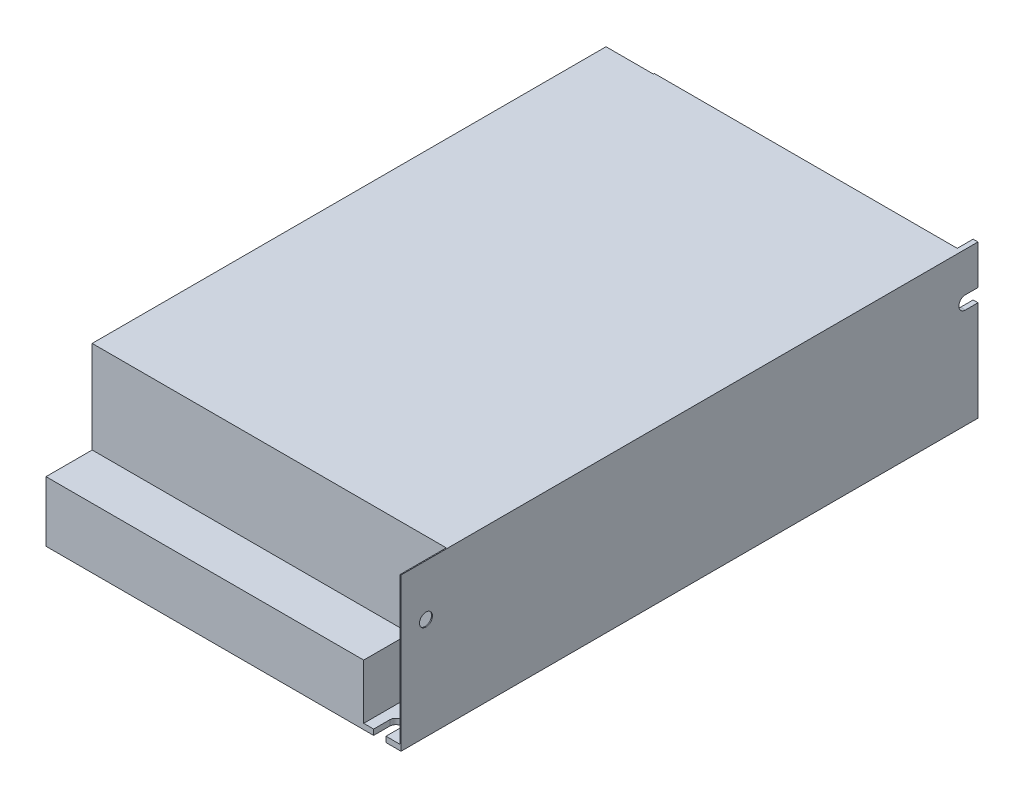
ISO-10303-21;
HEADER;
FILE_DESCRIPTION(('STEP AP214'),'2;1');
FILE_NAME('part.step','',(''),(''),'','','');
FILE_SCHEMA(('AUTOMOTIVE_DESIGN { 1 0 10303 214 1 1 1 1 }'));
ENDSEC;
DATA;
#1=APPLICATION_CONTEXT('core data for automotive mechanical design processes');
#2=APPLICATION_PROTOCOL_DEFINITION('international standard','automotive_design',2000,#1);
#3=PRODUCT_CONTEXT('',#1,'mechanical');
#4=PRODUCT('Part','Part','',(#3));
#5=PRODUCT_RELATED_PRODUCT_CATEGORY('part','',(#4));
#6=PRODUCT_DEFINITION_FORMATION('','',#4);
#7=PRODUCT_DEFINITION_CONTEXT('part definition',#1,'design');
#8=PRODUCT_DEFINITION('design','',#6,#7);
#9=PRODUCT_DEFINITION_SHAPE('','',#8);
#10=(LENGTH_UNIT() NAMED_UNIT(*) SI_UNIT(.MILLI.,.METRE.));
#11=(NAMED_UNIT(*) PLANE_ANGLE_UNIT() SI_UNIT($,.RADIAN.));
#12=(NAMED_UNIT(*) SI_UNIT($,.STERADIAN.) SOLID_ANGLE_UNIT());
#13=UNCERTAINTY_MEASURE_WITH_UNIT(LENGTH_MEASURE(1.E-05),#10,'distance_accuracy_value','');
#14=(GEOMETRIC_REPRESENTATION_CONTEXT(3) GLOBAL_UNCERTAINTY_ASSIGNED_CONTEXT((#13)) GLOBAL_UNIT_ASSIGNED_CONTEXT((#10,
#11,#12)) REPRESENTATION_CONTEXT('',''));
#15=CARTESIAN_POINT('',(0.,0.,0.));
#16=DIRECTION('',(0.,0.,1.));
#17=DIRECTION('',(1.,0.,0.));
#18=AXIS2_PLACEMENT_3D('',#15,#16,#17);
#19=CARTESIAN_POINT('',(0.,42.,0.));
#20=DIRECTION('',(0.,0.,-1.));
#21=DIRECTION('',(-1.,0.,0.));
#22=AXIS2_PLACEMENT_3D('',#19,#20,#21);
#23=PLANE('',#22);
#24=DIRECTION('',(1.,0.,0.));
#25=VECTOR('',#24,1.);
#26=CARTESIAN_POINT('',(97.4344,1.524,0.));
#27=LINE('',#26,#25);
#28=CARTESIAN_POINT('',(93.5482,1.524,0.));
#29=VERTEX_POINT('',#28);
#30=CARTESIAN_POINT('',(97.4344,1.524,0.));
#31=VERTEX_POINT('',#30);
#32=EDGE_CURVE('E272',#29,#31,#27,.T.);
#33=ORIENTED_EDGE('',*,*,#32,.F.);
#34=DIRECTION('',(0.,-1.,0.));
#35=VECTOR('',#34,1.);
#36=CARTESIAN_POINT('',(93.5482,8.55021115538097,0.));
#37=LINE('',#36,#35);
#38=CARTESIAN_POINT('',(93.5482,0.,0.));
#39=VERTEX_POINT('',#38);
#40=EDGE_CURVE('E256',#29,#39,#37,.T.);
#41=ORIENTED_EDGE('',*,*,#40,.T.);
#42=DIRECTION('',(1.,0.,0.));
#43=VECTOR('',#42,1.);
#44=CARTESIAN_POINT('',(0.,0.,0.));
#45=LINE('',#44,#43);
#46=CARTESIAN_POINT('',(97.6884,0.,0.));
#47=VERTEX_POINT('',#46);
#48=EDGE_CURVE('E269',#39,#47,#45,.T.);
#49=ORIENTED_EDGE('',*,*,#48,.T.);
#50=DIRECTION('',(0.,-1.,0.));
#51=VECTOR('',#50,1.);
#52=CARTESIAN_POINT('',(97.6884,42.,0.));
#53=LINE('',#52,#51);
#54=CARTESIAN_POINT('',(97.6884,42.,0.));
#55=VERTEX_POINT('',#54);
#56=EDGE_CURVE('E304',#55,#47,#53,.T.);
#57=ORIENTED_EDGE('',*,*,#56,.F.);
#58=DIRECTION('',(1.,0.,0.));
#59=VECTOR('',#58,1.);
#60=CARTESIAN_POINT('',(0.,42.,0.));
#61=LINE('',#60,#59);
#62=CARTESIAN_POINT('',(97.4344,42.,0.));
#63=VERTEX_POINT('',#62);
#64=EDGE_CURVE('E444',#63,#55,#61,.T.);
#65=ORIENTED_EDGE('',*,*,#64,.F.);
#66=DIRECTION('',(0.,1.,0.));
#67=VECTOR('',#66,1.);
#68=CARTESIAN_POINT('',(97.4344,42.,0.));
#69=LINE('',#68,#67);
#70=EDGE_CURVE('E286',#31,#63,#69,.T.);
#71=ORIENTED_EDGE('',*,*,#70,.F.);
#72=EDGE_LOOP('',(#33,#41,#49,#57,#65,#71));
#73=FACE_BOUND('',#72,.T.);
#74=ADVANCED_FACE('F45',(#73),#23,.F.);
#75=CARTESIAN_POINT('',(0.,42.,-158.75));
#76=DIRECTION('',(0.,0.,1.));
#77=DIRECTION('',(1.,0.,0.));
#78=AXIS2_PLACEMENT_3D('',#75,#76,#77);
#79=PLANE('',#78);
#80=DIRECTION('',(0.,1.,0.));
#81=VECTOR('',#80,1.);
#82=CARTESIAN_POINT('',(96.3549,11.7867,-158.75));
#83=LINE('',#82,#81);
#84=CARTESIAN_POINT('',(96.3549,11.7867,-158.75));
#85=VERTEX_POINT('',#84);
#86=CARTESIAN_POINT('',(96.3549,27.5093,-158.75));
#87=VERTEX_POINT('',#86);
#88=EDGE_CURVE('E350',#85,#87,#83,.T.);
#89=ORIENTED_EDGE('',*,*,#88,.T.);
#90=DIRECTION('',(1.,0.,0.));
#91=VECTOR('',#90,1.);
#92=CARTESIAN_POINT('',(89.955999612238,27.5093,-158.75));
#93=LINE('',#92,#91);
#94=CARTESIAN_POINT('',(97.6884,27.5093,-158.75));
#95=VERTEX_POINT('',#94);
#96=EDGE_CURVE('E469',#87,#95,#93,.T.);
#97=ORIENTED_EDGE('',*,*,#96,.T.);
#98=DIRECTION('',(0.,-1.,0.));
#99=VECTOR('',#98,1.);
#100=CARTESIAN_POINT('',(97.6884,42.,-158.75));
#101=LINE('',#100,#99);
#102=CARTESIAN_POINT('',(97.6884,0.,-158.75));
#103=VERTEX_POINT('',#102);
#104=EDGE_CURVE('E299',#95,#103,#101,.T.);
#105=ORIENTED_EDGE('',*,*,#104,.T.);
#106=DIRECTION('',(-1.,0.,0.));
#107=VECTOR('',#106,1.);
#108=CARTESIAN_POINT('',(0.,0.,-158.75));
#109=LINE('',#108,#107);
#110=CARTESIAN_POINT('',(8.255,0.,-158.75));
#111=VERTEX_POINT('',#110);
#112=EDGE_CURVE('E292',#103,#111,#109,.T.);
#113=ORIENTED_EDGE('',*,*,#112,.T.);
#114=DIRECTION('',(0.,1.,0.));
#115=VECTOR('',#114,1.);
#116=CARTESIAN_POINT('',(8.255,0.,-158.75));
#117=LINE('',#116,#115);
#118=CARTESIAN_POINT('',(8.255,1.524,-158.75));
#119=VERTEX_POINT('',#118);
#120=EDGE_CURVE('E340',#111,#119,#117,.T.);
#121=ORIENTED_EDGE('',*,*,#120,.T.);
#122=DIRECTION('',(-1.,0.,0.));
#123=VECTOR('',#122,1.);
#124=CARTESIAN_POINT('',(0.,1.524,-158.75));
#125=LINE('',#124,#123);
#126=CARTESIAN_POINT('',(13.0175,1.524,-158.75));
#127=VERTEX_POINT('',#126);
#128=EDGE_CURVE('E385',#127,#119,#125,.T.);
#129=ORIENTED_EDGE('',*,*,#128,.F.);
#130=DIRECTION('',(0.,1.,0.));
#131=VECTOR('',#130,1.);
#132=CARTESIAN_POINT('',(13.0175,-13.8267601071256,-158.75));
#133=LINE('',#132,#131);
#134=CARTESIAN_POINT('',(13.0175,11.7867,-158.75));
#135=VERTEX_POINT('',#134);
#136=EDGE_CURVE('E392',#127,#135,#133,.T.);
#137=ORIENTED_EDGE('',*,*,#136,.T.);
#138=DIRECTION('',(-1.,0.,0.));
#139=VECTOR('',#138,1.);
#140=CARTESIAN_POINT('',(96.3549,11.7867,-158.75));
#141=LINE('',#140,#139);
#142=EDGE_CURVE('E338',#85,#135,#141,.T.);
#143=ORIENTED_EDGE('',*,*,#142,.F.);
#144=EDGE_LOOP('',(#89,#97,#105,#113,#121,#129,#137,#143));
#145=FACE_BOUND('',#144,.T.);
#146=ADVANCED_FACE('F525',(#145),#79,.F.);
#147=CARTESIAN_POINT('',(96.3549,11.7867,-158.75));
#148=DIRECTION('',(1.,0.,0.));
#149=DIRECTION('',(0.,0.,-1.));
#150=AXIS2_PLACEMENT_3D('',#147,#148,#149);
#151=PLANE('',#150);
#152=CARTESIAN_POINT('',(96.3549,29.31905,-155.2829));
#153=DIRECTION('',(1.,0.,0.));
#154=DIRECTION('',(0.,0.,-1.));
#155=AXIS2_PLACEMENT_3D('',#152,#153,#154);
#156=CIRCLE('',#155,1.80975);
#157=CARTESIAN_POINT('',(96.3549,27.5093,-155.2829));
#158=VERTEX_POINT('',#157);
#159=CARTESIAN_POINT('',(96.3549,27.7572985144877,-154.3685));
#160=VERTEX_POINT('',#159);
#161=EDGE_CURVE('E468',#158,#160,#156,.F.);
#162=ORIENTED_EDGE('',*,*,#161,.F.);
#163=DIRECTION('',(0.,0.,1.));
#164=VECTOR('',#163,1.);
#165=CARTESIAN_POINT('',(96.3549,27.5093,-155.2829));
#166=LINE('',#165,#164);
#167=EDGE_CURVE('E471',#87,#158,#166,.T.);
#168=ORIENTED_EDGE('',*,*,#167,.F.);
#169=ORIENTED_EDGE('',*,*,#88,.F.);
#170=DIRECTION('',(0.,0.,-1.));
#171=VECTOR('',#170,1.);
#172=CARTESIAN_POINT('',(96.3549,11.7867,-158.75));
#173=LINE('',#172,#171);
#174=CARTESIAN_POINT('',(96.3549,11.7867,-154.3685));
#175=VERTEX_POINT('',#174);
#176=EDGE_CURVE('E335',#175,#85,#173,.T.);
#177=ORIENTED_EDGE('',*,*,#176,.F.);
#178=DIRECTION('',(0.,1.,0.));
#179=VECTOR('',#178,1.);
#180=CARTESIAN_POINT('',(96.3549,11.7867,-154.3685));
#181=LINE('',#180,#179);
#182=EDGE_CURVE('E344',#175,#160,#181,.T.);
#183=ORIENTED_EDGE('',*,*,#182,.T.);
#184=EDGE_LOOP('',(#162,#168,#169,#177,#183));
#185=FACE_BOUND('',#184,.T.);
#186=ADVANCED_FACE('F522',(#185),#151,.F.);
#187=CARTESIAN_POINT('',(97.6884,42.,-158.75));
#188=VERTEX_POINT('',#187);
#189=CARTESIAN_POINT('',(97.6884,31.1288,-158.75));
#190=VERTEX_POINT('',#189);
#191=EDGE_CURVE('E301',#188,#190,#101,.T.);
#192=ORIENTED_EDGE('',*,*,#191,.T.);
#193=DIRECTION('',(1.,0.,0.));
#194=VECTOR('',#193,1.);
#195=CARTESIAN_POINT('',(89.955999612238,31.1288,-158.75));
#196=LINE('',#195,#194);
#197=CARTESIAN_POINT('',(96.3549,31.1288,-158.75));
#198=VERTEX_POINT('',#197);
#199=EDGE_CURVE('E454',#198,#190,#196,.T.);
#200=ORIENTED_EDGE('',*,*,#199,.F.);
#201=CARTESIAN_POINT('',(96.3549,42.,-158.75));
#202=VERTEX_POINT('',#201);
#203=EDGE_CURVE('E353',#198,#202,#83,.T.);
#204=ORIENTED_EDGE('',*,*,#203,.T.);
#205=DIRECTION('',(-1.,0.,0.));
#206=VECTOR('',#205,1.);
#207=CARTESIAN_POINT('',(0.,42.,-158.75));
#208=LINE('',#207,#206);
#209=EDGE_CURVE('E300',#188,#202,#208,.T.);
#210=ORIENTED_EDGE('',*,*,#209,.F.);
#211=EDGE_LOOP('',(#192,#200,#204,#210));
#212=FACE_BOUND('',#211,.T.);
#213=ADVANCED_FACE('F451',(#212),#79,.F.);
#214=CARTESIAN_POINT('',(0.,-13.8267601071256,-154.0891));
#215=DIRECTION('',(0.,0.,1.));
#216=DIRECTION('',(1.,0.,0.));
#217=AXIS2_PLACEMENT_3D('',#214,#215,#216);
#218=PLANE('',#217);
#219=DIRECTION('',(0.,1.,0.));
#220=VECTOR('',#219,1.);
#221=CARTESIAN_POINT('',(0.508000000000001,-13.8267601071256,-154.0891));
#222=LINE('',#221,#220);
#223=CARTESIAN_POINT('',(0.508000000000001,1.524,-154.0891));
#224=VERTEX_POINT('',#223);
#225=CARTESIAN_POINT('',(0.508000000000001,9.144,-154.0891));
#226=VERTEX_POINT('',#225);
#227=EDGE_CURVE('E308',#224,#226,#222,.T.);
#228=ORIENTED_EDGE('',*,*,#227,.F.);
#229=DIRECTION('',(1.,0.,0.));
#230=VECTOR('',#229,1.);
#231=CARTESIAN_POINT('',(0.,1.524,-154.0891));
#232=LINE('',#231,#230);
#233=CARTESIAN_POINT('',(0.,1.524,-154.0891));
#234=VERTEX_POINT('',#233);
#235=EDGE_CURVE('E375',#234,#224,#232,.T.);
#236=ORIENTED_EDGE('',*,*,#235,.F.);
#237=DIRECTION('',(0.,1.,0.));
#238=VECTOR('',#237,1.);
#239=CARTESIAN_POINT('',(0.,-13.8267601071256,-154.0891));
#240=LINE('',#239,#238);
#241=CARTESIAN_POINT('',(0.,42.,-154.0891));
#242=VERTEX_POINT('',#241);
#243=EDGE_CURVE('E384',#234,#242,#240,.T.);
#244=ORIENTED_EDGE('',*,*,#243,.T.);
#245=DIRECTION('',(1.,0.,0.));
#246=VECTOR('',#245,1.);
#247=CARTESIAN_POINT('',(0.,42.,-154.0891));
#248=LINE('',#247,#246);
#249=CARTESIAN_POINT('',(13.0175,42.,-154.0891));
#250=VERTEX_POINT('',#249);
#251=EDGE_CURVE('E373',#242,#250,#248,.T.);
#252=ORIENTED_EDGE('',*,*,#251,.T.);
#253=DIRECTION('',(0.,1.,0.));
#254=VECTOR('',#253,1.);
#255=CARTESIAN_POINT('',(13.0175,-13.8267601071256,-154.0891));
#256=LINE('',#255,#254);
#257=CARTESIAN_POINT('',(13.0175,9.144,-154.0891));
#258=VERTEX_POINT('',#257);
#259=EDGE_CURVE('E380',#258,#250,#256,.T.);
#260=ORIENTED_EDGE('',*,*,#259,.F.);
#261=DIRECTION('',(1.,0.,0.));
#262=VECTOR('',#261,1.);
#263=CARTESIAN_POINT('',(0.,9.144,-154.0891));
#264=LINE('',#263,#262);
#265=EDGE_CURVE('E371',#226,#258,#264,.T.);
#266=ORIENTED_EDGE('',*,*,#265,.F.);
#267=EDGE_LOOP('',(#228,#236,#244,#252,#260,#266));
#268=FACE_BOUND('',#267,.T.);
#269=ADVANCED_FACE('F545',(#268),#218,.F.);
#270=CARTESIAN_POINT('',(0.,42.,0.));
#271=DIRECTION('',(1.,0.,0.));
#272=DIRECTION('',(0.,0.,-1.));
#273=AXIS2_PLACEMENT_3D('',#270,#271,#272);
#274=PLANE('',#273);
#275=ORIENTED_EDGE('',*,*,#243,.F.);
#276=DIRECTION('',(0.,0.,1.));
#277=VECTOR('',#276,1.);
#278=CARTESIAN_POINT('',(0.,1.524,-158.75));
#279=LINE('',#278,#277);
#280=CARTESIAN_POINT('',(0.,1.524,-158.75));
#281=VERTEX_POINT('',#280);
#282=EDGE_CURVE('E381',#281,#234,#279,.T.);
#283=ORIENTED_EDGE('',*,*,#282,.F.);
#284=DIRECTION('',(0.,-1.,0.));
#285=VECTOR('',#284,1.);
#286=CARTESIAN_POINT('',(0.,42.,-158.75));
#287=LINE('',#286,#285);
#288=CARTESIAN_POINT('',(0.,0.,-158.75));
#289=VERTEX_POINT('',#288);
#290=EDGE_CURVE('E296',#281,#289,#287,.T.);
#291=ORIENTED_EDGE('',*,*,#290,.T.);
#292=DIRECTION('',(0.,0.,1.));
#293=VECTOR('',#292,1.);
#294=CARTESIAN_POINT('',(0.,0.,0.));
#295=LINE('',#294,#293);
#296=CARTESIAN_POINT('',(0.,0.,0.));
#297=VERTEX_POINT('',#296);
#298=EDGE_CURVE('E282',#289,#297,#295,.T.);
#299=ORIENTED_EDGE('',*,*,#298,.T.);
#300=DIRECTION('',(0.,-1.,0.));
#301=VECTOR('',#300,1.);
#302=CARTESIAN_POINT('',(0.,42.,0.));
#303=LINE('',#302,#301);
#304=CARTESIAN_POINT('',(0.,16.6,0.));
#305=VERTEX_POINT('',#304);
#306=EDGE_CURVE('E306',#305,#297,#303,.T.);
#307=ORIENTED_EDGE('',*,*,#306,.F.);
#308=DIRECTION('',(0.,0.,-1.));
#309=VECTOR('',#308,1.);
#310=CARTESIAN_POINT('',(0.,16.6,0.));
#311=LINE('',#310,#309);
#312=CARTESIAN_POINT('',(0.,16.6,-12.7));
#313=VERTEX_POINT('',#312);
#314=EDGE_CURVE('E420',#305,#313,#311,.T.);
#315=ORIENTED_EDGE('',*,*,#314,.T.);
#316=DIRECTION('',(0.,1.,0.));
#317=VECTOR('',#316,1.);
#318=CARTESIAN_POINT('',(0.,42.,-12.7));
#319=LINE('',#318,#317);
#320=CARTESIAN_POINT('',(0.,42.,-12.7));
#321=VERTEX_POINT('',#320);
#322=EDGE_CURVE('E431',#313,#321,#319,.T.);
#323=ORIENTED_EDGE('',*,*,#322,.T.);
#324=DIRECTION('',(0.,0.,1.));
#325=VECTOR('',#324,1.);
#326=CARTESIAN_POINT('',(0.,42.,0.));
#327=LINE('',#326,#325);
#328=EDGE_CURVE('E295',#242,#321,#327,.T.);
#329=ORIENTED_EDGE('',*,*,#328,.F.);
#330=EDGE_LOOP('',(#275,#283,#291,#299,#307,#315,#323,#329));
#331=FACE_BOUND('',#330,.T.);
#332=ADVANCED_FACE('F47',(#331),#274,.F.);
#333=CARTESIAN_POINT('',(90.1446,0.,0.));
#334=VERTEX_POINT('',#333);
#335=EDGE_CURVE('E281',#297,#334,#45,.T.);
#336=ORIENTED_EDGE('',*,*,#335,.T.);
#337=DIRECTION('',(0.,-1.,0.));
#338=VECTOR('',#337,1.);
#339=CARTESIAN_POINT('',(90.1446,8.55021115538097,0.));
#340=LINE('',#339,#338);
#341=CARTESIAN_POINT('',(90.1446,1.524,0.));
#342=VERTEX_POINT('',#341);
#343=EDGE_CURVE('E273',#342,#334,#340,.T.);
#344=ORIENTED_EDGE('',*,*,#343,.F.);
#345=CARTESIAN_POINT('',(87.4141,1.524,0.));
#346=VERTEX_POINT('',#345);
#347=EDGE_CURVE('E409',#346,#342,#27,.T.);
#348=ORIENTED_EDGE('',*,*,#347,.F.);
#349=DIRECTION('',(0.,1.,0.));
#350=VECTOR('',#349,1.);
#351=CARTESIAN_POINT('',(87.4141,-14.2518956370723,0.));
#352=LINE('',#351,#350);
#353=CARTESIAN_POINT('',(87.4141,16.6,0.));
#354=VERTEX_POINT('',#353);
#355=EDGE_CURVE('E415',#346,#354,#352,.T.);
#356=ORIENTED_EDGE('',*,*,#355,.T.);
#357=DIRECTION('',(-1.,0.,0.));
#358=VECTOR('',#357,1.);
#359=CARTESIAN_POINT('',(126.086463314247,16.6,0.));
#360=LINE('',#359,#358);
#361=EDGE_CURVE('E439',#354,#305,#360,.T.);
#362=ORIENTED_EDGE('',*,*,#361,.T.);
#363=ORIENTED_EDGE('',*,*,#306,.T.);
#364=EDGE_LOOP('',(#336,#344,#348,#356,#362,#363));
#365=FACE_BOUND('',#364,.T.);
#366=ADVANCED_FACE('F580',(#365),#23,.F.);
#367=CARTESIAN_POINT('',(0.,42.,0.));
#368=DIRECTION('',(0.,-1.,0.));
#369=DIRECTION('',(0.,0.,-1.));
#370=AXIS2_PLACEMENT_3D('',#367,#368,#369);
#371=PLANE('',#370);
#372=ORIENTED_EDGE('',*,*,#209,.T.);
#373=DIRECTION('',(0.,0.,-1.));
#374=VECTOR('',#373,1.);
#375=CARTESIAN_POINT('',(96.3549,42.,-158.75));
#376=LINE('',#375,#374);
#377=CARTESIAN_POINT('',(96.3549,42.,-154.3685));
#378=VERTEX_POINT('',#377);
#379=EDGE_CURVE('E334',#378,#202,#376,.T.);
#380=ORIENTED_EDGE('',*,*,#379,.F.);
#381=DIRECTION('',(1.,0.,0.));
#382=VECTOR('',#381,1.);
#383=CARTESIAN_POINT('',(96.3549,42.,-154.3685));
#384=LINE('',#383,#382);
#385=CARTESIAN_POINT('',(13.0175,42.,-154.3685));
#386=VERTEX_POINT('',#385);
#387=EDGE_CURVE('E325',#386,#378,#384,.T.);
#388=ORIENTED_EDGE('',*,*,#387,.F.);
#389=DIRECTION('',(0.,0.,-1.));
#390=VECTOR('',#389,1.);
#391=CARTESIAN_POINT('',(13.0175,42.,-158.75));
#392=LINE('',#391,#390);
#393=EDGE_CURVE('E318',#250,#386,#392,.T.);
#394=ORIENTED_EDGE('',*,*,#393,.F.);
#395=ORIENTED_EDGE('',*,*,#251,.F.);
#396=ORIENTED_EDGE('',*,*,#328,.T.);
#397=DIRECTION('',(-1.,0.,0.));
#398=VECTOR('',#397,1.);
#399=CARTESIAN_POINT('',(126.086463314247,42.,-12.7));
#400=LINE('',#399,#398);
#401=CARTESIAN_POINT('',(97.4344,42.,-12.7));
#402=VERTEX_POINT('',#401);
#403=EDGE_CURVE('E434',#402,#321,#400,.T.);
#404=ORIENTED_EDGE('',*,*,#403,.F.);
#405=DIRECTION('',(0.,0.,-1.));
#406=VECTOR('',#405,1.);
#407=CARTESIAN_POINT('',(97.4344,42.,0.));
#408=LINE('',#407,#406);
#409=EDGE_CURVE('E425',#63,#402,#408,.T.);
#410=ORIENTED_EDGE('',*,*,#409,.F.);
#411=ORIENTED_EDGE('',*,*,#64,.T.);
#412=DIRECTION('',(0.,0.,-1.));
#413=VECTOR('',#412,1.);
#414=CARTESIAN_POINT('',(97.6884,42.,0.));
#415=LINE('',#414,#413);
#416=EDGE_CURVE('E446',#55,#188,#415,.T.);
#417=ORIENTED_EDGE('',*,*,#416,.T.);
#418=EDGE_LOOP('',(#372,#380,#388,#394,#395,#396,#404,#410,#411,#417));
#419=FACE_BOUND('',#418,.T.);
#420=ADVANCED_FACE('F331',(#419),#371,.F.);
#421=CARTESIAN_POINT('',(97.6884,42.,0.));
#422=DIRECTION('',(-1.,0.,0.));
#423=DIRECTION('',(0.,0.,1.));
#424=AXIS2_PLACEMENT_3D('',#421,#422,#423);
#425=PLANE('',#424);
#426=CARTESIAN_POINT('',(97.6884,27.9665,-6.858));
#427=DIRECTION('',(1.,0.,0.));
#428=DIRECTION('',(0.,0.,-1.));
#429=AXIS2_PLACEMENT_3D('',#426,#427,#428);
#430=CIRCLE('',#429,1.778);
#431=CARTESIAN_POINT('',(97.6884,27.9665,-8.636));
#432=VERTEX_POINT('',#431);
#433=EDGE_CURVE('E645',#432,#432,#430,.T.);
#434=ORIENTED_EDGE('',*,*,#433,.F.);
#435=EDGE_LOOP('',(#434));
#436=FACE_BOUND('',#435,.T.);
#437=ORIENTED_EDGE('',*,*,#104,.F.);
#438=DIRECTION('',(0.,0.,-1.));
#439=VECTOR('',#438,1.);
#440=CARTESIAN_POINT('',(97.6884,27.5093,-155.2829));
#441=LINE('',#440,#439);
#442=CARTESIAN_POINT('',(97.6884,27.5093,-155.2829));
#443=VERTEX_POINT('',#442);
#444=EDGE_CURVE('E486',#443,#95,#441,.T.);
#445=ORIENTED_EDGE('',*,*,#444,.F.);
#446=CARTESIAN_POINT('',(97.6884,29.31905,-155.2829));
#447=DIRECTION('',(1.,0.,0.));
#448=DIRECTION('',(0.,0.,-1.));
#449=AXIS2_PLACEMENT_3D('',#446,#447,#448);
#450=CIRCLE('',#449,1.80975);
#451=CARTESIAN_POINT('',(97.6884,31.1288,-155.2829));
#452=VERTEX_POINT('',#451);
#453=EDGE_CURVE('E483',#452,#443,#450,.T.);
#454=ORIENTED_EDGE('',*,*,#453,.F.);
#455=DIRECTION('',(0.,0.,1.));
#456=VECTOR('',#455,1.);
#457=CARTESIAN_POINT('',(97.6884,31.1288,-158.75));
#458=LINE('',#457,#456);
#459=EDGE_CURVE('E481',#190,#452,#458,.T.);
#460=ORIENTED_EDGE('',*,*,#459,.F.);
#461=ORIENTED_EDGE('',*,*,#191,.F.);
#462=ORIENTED_EDGE('',*,*,#416,.F.);
#463=ORIENTED_EDGE('',*,*,#56,.T.);
#464=DIRECTION('',(0.,0.,-1.));
#465=VECTOR('',#464,1.);
#466=CARTESIAN_POINT('',(97.6884,0.,0.));
#467=LINE('',#466,#465);
#468=EDGE_CURVE('E280',#47,#103,#467,.T.);
#469=ORIENTED_EDGE('',*,*,#468,.T.);
#470=EDGE_LOOP('',(#437,#445,#454,#460,#461,#462,#463,#469));
#471=FACE_BOUND('',#470,.T.);
#472=ADVANCED_FACE('F562',(#436,#471),#425,.F.);
#473=CARTESIAN_POINT('',(5.08,1.524,-158.75));
#474=VERTEX_POINT('',#473);
#475=EDGE_CURVE('E388',#474,#281,#125,.T.);
#476=ORIENTED_EDGE('',*,*,#475,.F.);
#477=DIRECTION('',(0.,1.,0.));
#478=VECTOR('',#477,1.);
#479=CARTESIAN_POINT('',(5.08,0.,-158.75));
#480=LINE('',#479,#478);
#481=CARTESIAN_POINT('',(5.08,0.,-158.75));
#482=VERTEX_POINT('',#481);
#483=EDGE_CURVE('E503',#482,#474,#480,.T.);
#484=ORIENTED_EDGE('',*,*,#483,.F.);
#485=EDGE_CURVE('E291',#482,#289,#109,.T.);
#486=ORIENTED_EDGE('',*,*,#485,.T.);
#487=ORIENTED_EDGE('',*,*,#290,.F.);
#488=EDGE_LOOP('',(#476,#484,#486,#487));
#489=FACE_BOUND('',#488,.T.);
#490=ADVANCED_FACE('F587',(#489),#79,.F.);
#491=CARTESIAN_POINT('',(0.,0.,0.));
#492=DIRECTION('',(0.,-1.,0.));
#493=DIRECTION('',(0.,0.,-1.));
#494=AXIS2_PLACEMENT_3D('',#491,#492,#493);
#495=PLANE('',#494);
#496=DIRECTION('',(0.,0.,1.));
#497=VECTOR('',#496,1.);
#498=CARTESIAN_POINT('',(93.5482,0.,-4.445));
#499=LINE('',#498,#497);
#500=CARTESIAN_POINT('',(93.5482,0.,-4.445));
#501=VERTEX_POINT('',#500);
#502=EDGE_CURVE('E253',#501,#39,#499,.T.);
#503=ORIENTED_EDGE('',*,*,#502,.F.);
#504=CARTESIAN_POINT('',(91.8464,0.,-4.445));
#505=DIRECTION('',(0.,-1.,0.));
#506=DIRECTION('',(0.,0.,-1.));
#507=AXIS2_PLACEMENT_3D('',#504,#505,#506);
#508=CIRCLE('',#507,1.70179999999999);
#509=CARTESIAN_POINT('',(90.1446,0.,-4.445));
#510=VERTEX_POINT('',#509);
#511=EDGE_CURVE('E274',#510,#501,#508,.T.);
#512=ORIENTED_EDGE('',*,*,#511,.F.);
#513=DIRECTION('',(0.,0.,-1.));
#514=VECTOR('',#513,1.);
#515=CARTESIAN_POINT('',(90.1446,0.,0.));
#516=LINE('',#515,#514);
#517=EDGE_CURVE('E264',#334,#510,#516,.T.);
#518=ORIENTED_EDGE('',*,*,#517,.F.);
#519=ORIENTED_EDGE('',*,*,#335,.F.);
#520=ORIENTED_EDGE('',*,*,#298,.F.);
#521=ORIENTED_EDGE('',*,*,#485,.F.);
#522=DIRECTION('',(0.,0.,1.));
#523=VECTOR('',#522,1.);
#524=CARTESIAN_POINT('',(5.08,0.,-158.75));
#525=LINE('',#524,#523);
#526=CARTESIAN_POINT('',(5.08,0.,-154.813));
#527=VERTEX_POINT('',#526);
#528=EDGE_CURVE('E493',#482,#527,#525,.T.);
#529=ORIENTED_EDGE('',*,*,#528,.T.);
#530=CARTESIAN_POINT('',(6.6675,0.,-154.813));
#531=DIRECTION('',(0.,1.,0.));
#532=DIRECTION('',(0.,0.,1.));
#533=AXIS2_PLACEMENT_3D('',#530,#531,#532);
#534=CIRCLE('',#533,1.5875);
#535=CARTESIAN_POINT('',(8.255,0.,-154.813));
#536=VERTEX_POINT('',#535);
#537=EDGE_CURVE('E496',#527,#536,#534,.T.);
#538=ORIENTED_EDGE('',*,*,#537,.T.);
#539=DIRECTION('',(0.,0.,-1.));
#540=VECTOR('',#539,1.);
#541=CARTESIAN_POINT('',(8.255,0.,-154.813));
#542=LINE('',#541,#540);
#543=EDGE_CURVE('E500',#536,#111,#542,.T.);
#544=ORIENTED_EDGE('',*,*,#543,.T.);
#545=ORIENTED_EDGE('',*,*,#112,.F.);
#546=ORIENTED_EDGE('',*,*,#468,.F.);
#547=ORIENTED_EDGE('',*,*,#48,.F.);
#548=EDGE_LOOP('',(#503,#512,#518,#519,#520,#521,#529,#538,#544,#545,#546,#547));
#549=FACE_BOUND('',#548,.T.);
#550=ADVANCED_FACE('F277',(#549),#495,.T.);
#551=CARTESIAN_POINT('',(126.086463314247,42.,-12.7));
#552=DIRECTION('',(0.,0.,1.));
#553=DIRECTION('',(0.,-1.,0.));
#554=AXIS2_PLACEMENT_3D('',#551,#552,#553);
#555=PLANE('',#554);
#556=ORIENTED_EDGE('',*,*,#403,.T.);
#557=ORIENTED_EDGE('',*,*,#322,.F.);
#558=DIRECTION('',(-1.,0.,0.));
#559=VECTOR('',#558,1.);
#560=CARTESIAN_POINT('',(126.086463314247,16.6,-12.7));
#561=LINE('',#560,#559);
#562=CARTESIAN_POINT('',(97.4344,16.6,-12.7));
#563=VERTEX_POINT('',#562);
#564=EDGE_CURVE('E437',#563,#313,#561,.T.);
#565=ORIENTED_EDGE('',*,*,#564,.F.);
#566=DIRECTION('',(0.,-1.,0.));
#567=VECTOR('',#566,1.);
#568=CARTESIAN_POINT('',(97.4344,42.,-12.7));
#569=LINE('',#568,#567);
#570=EDGE_CURVE('E421',#402,#563,#569,.T.);
#571=ORIENTED_EDGE('',*,*,#570,.F.);
#572=EDGE_LOOP('',(#556,#557,#565,#571));
#573=FACE_BOUND('',#572,.T.);
#574=ADVANCED_FACE('F556',(#573),#555,.T.);
#575=CARTESIAN_POINT('',(126.086463314247,16.6,0.));
#576=DIRECTION('',(0.,1.,0.));
#577=DIRECTION('',(0.,0.,1.));
#578=AXIS2_PLACEMENT_3D('',#575,#576,#577);
#579=PLANE('',#578);
#580=DIRECTION('',(-1.,0.,0.));
#581=VECTOR('',#580,1.);
#582=CARTESIAN_POINT('',(97.4344,16.6,-10.1346));
#583=LINE('',#582,#581);
#584=CARTESIAN_POINT('',(97.4344,16.6,-10.1346));
#585=VERTEX_POINT('',#584);
#586=CARTESIAN_POINT('',(87.4141,16.6,-10.1346));
#587=VERTEX_POINT('',#586);
#588=EDGE_CURVE('E396',#585,#587,#583,.T.);
#589=ORIENTED_EDGE('',*,*,#588,.F.);
#590=DIRECTION('',(0.,0.,1.));
#591=VECTOR('',#590,1.);
#592=CARTESIAN_POINT('',(97.4344,16.6,0.));
#593=LINE('',#592,#591);
#594=EDGE_CURVE('E424',#563,#585,#593,.T.);
#595=ORIENTED_EDGE('',*,*,#594,.F.);
#596=ORIENTED_EDGE('',*,*,#564,.T.);
#597=ORIENTED_EDGE('',*,*,#314,.F.);
#598=ORIENTED_EDGE('',*,*,#361,.F.);
#599=DIRECTION('',(0.,0.,1.));
#600=VECTOR('',#599,1.);
#601=CARTESIAN_POINT('',(87.4141,16.6,0.));
#602=LINE('',#601,#600);
#603=EDGE_CURVE('E397',#587,#354,#602,.T.);
#604=ORIENTED_EDGE('',*,*,#603,.F.);
#605=EDGE_LOOP('',(#589,#595,#596,#597,#598,#604));
#606=FACE_BOUND('',#605,.T.);
#607=ADVANCED_FACE('F658',(#606),#579,.T.);
#608=CARTESIAN_POINT('',(97.4344,42.,0.));
#609=DIRECTION('',(-1.,0.,0.));
#610=DIRECTION('',(0.,0.,1.));
#611=AXIS2_PLACEMENT_3D('',#608,#609,#610);
#612=PLANE('',#611);
#613=CARTESIAN_POINT('',(97.4344,27.9665,-6.858));
#614=DIRECTION('',(-1.,0.,0.));
#615=DIRECTION('',(0.,0.,1.));
#616=AXIS2_PLACEMENT_3D('',#613,#614,#615);
#617=CIRCLE('',#616,1.778);
#618=CARTESIAN_POINT('',(97.4344,27.9665,-5.08));
#619=VERTEX_POINT('',#618);
#620=EDGE_CURVE('E477',#619,#619,#617,.F.);
#621=ORIENTED_EDGE('',*,*,#620,.T.);
#622=EDGE_LOOP('',(#621));
#623=FACE_BOUND('',#622,.T.);
#624=ORIENTED_EDGE('',*,*,#594,.T.);
#625=DIRECTION('',(0.,1.,0.));
#626=VECTOR('',#625,1.);
#627=CARTESIAN_POINT('',(97.4344,-14.2518956370723,-10.1346));
#628=LINE('',#627,#626);
#629=CARTESIAN_POINT('',(97.4344,1.524,-10.1346));
#630=VERTEX_POINT('',#629);
#631=EDGE_CURVE('E408',#630,#585,#628,.T.);
#632=ORIENTED_EDGE('',*,*,#631,.F.);
#633=DIRECTION('',(0.,0.,-1.));
#634=VECTOR('',#633,1.);
#635=CARTESIAN_POINT('',(97.4344,1.524,0.));
#636=LINE('',#635,#634);
#637=EDGE_CURVE('E405',#31,#630,#636,.T.);
#638=ORIENTED_EDGE('',*,*,#637,.F.);
#639=ORIENTED_EDGE('',*,*,#70,.T.);
#640=ORIENTED_EDGE('',*,*,#409,.T.);
#641=ORIENTED_EDGE('',*,*,#570,.T.);
#642=EDGE_LOOP('',(#624,#632,#638,#639,#640,#641));
#643=FACE_BOUND('',#642,.T.);
#644=ADVANCED_FACE('F655',(#623,#643),#612,.T.);
#645=CARTESIAN_POINT('',(0.,1.524,0.));
#646=DIRECTION('',(0.,-1.,0.));
#647=DIRECTION('',(0.,0.,-1.));
#648=AXIS2_PLACEMENT_3D('',#645,#646,#647);
#649=PLANE('',#648);
#650=CARTESIAN_POINT('',(91.8464,1.524,-4.445));
#651=DIRECTION('',(0.,-1.,0.));
#652=DIRECTION('',(0.,0.,-1.));
#653=AXIS2_PLACEMENT_3D('',#650,#651,#652);
#654=CIRCLE('',#653,1.70179999999999);
#655=CARTESIAN_POINT('',(93.5482,1.524,-4.445));
#656=VERTEX_POINT('',#655);
#657=CARTESIAN_POINT('',(90.1446,1.524,-4.445));
#658=VERTEX_POINT('',#657);
#659=EDGE_CURVE('E635',#656,#658,#654,.F.);
#660=ORIENTED_EDGE('',*,*,#659,.F.);
#661=DIRECTION('',(0.,0.,-1.));
#662=VECTOR('',#661,1.);
#663=CARTESIAN_POINT('',(93.5482,1.524,-4.445));
#664=LINE('',#663,#662);
#665=EDGE_CURVE('E638',#29,#656,#664,.T.);
#666=ORIENTED_EDGE('',*,*,#665,.F.);
#667=ORIENTED_EDGE('',*,*,#32,.T.);
#668=ORIENTED_EDGE('',*,*,#637,.T.);
#669=DIRECTION('',(-1.,0.,0.));
#670=VECTOR('',#669,1.);
#671=CARTESIAN_POINT('',(97.4344,1.524,-10.1346));
#672=LINE('',#671,#670);
#673=CARTESIAN_POINT('',(87.4141,1.52399999999999,-10.1346));
#674=VERTEX_POINT('',#673);
#675=EDGE_CURVE('E399',#630,#674,#672,.T.);
#676=ORIENTED_EDGE('',*,*,#675,.T.);
#677=DIRECTION('',(0.,0.,1.));
#678=VECTOR('',#677,1.);
#679=CARTESIAN_POINT('',(87.4141,1.524,0.));
#680=LINE('',#679,#678);
#681=EDGE_CURVE('E412',#674,#346,#680,.T.);
#682=ORIENTED_EDGE('',*,*,#681,.T.);
#683=ORIENTED_EDGE('',*,*,#347,.T.);
#684=DIRECTION('',(0.,0.,1.));
#685=VECTOR('',#684,1.);
#686=CARTESIAN_POINT('',(90.1446,1.524,0.));
#687=LINE('',#686,#685);
#688=EDGE_CURVE('E639',#658,#342,#687,.T.);
#689=ORIENTED_EDGE('',*,*,#688,.F.);
#690=EDGE_LOOP('',(#660,#666,#667,#668,#676,#682,#683,#689));
#691=FACE_BOUND('',#690,.T.);
#692=ADVANCED_FACE('F641',(#691),#649,.F.);
#693=CARTESIAN_POINT('',(97.4344,-14.2518956370723,-10.1346));
#694=DIRECTION('',(0.,0.,-1.));
#695=DIRECTION('',(0.,1.,0.));
#696=AXIS2_PLACEMENT_3D('',#693,#694,#695);
#697=PLANE('',#696);
#698=ORIENTED_EDGE('',*,*,#631,.T.);
#699=ORIENTED_EDGE('',*,*,#588,.T.);
#700=DIRECTION('',(0.,1.,0.));
#701=VECTOR('',#700,1.);
#702=CARTESIAN_POINT('',(87.4141,-14.2518956370723,-10.1346));
#703=LINE('',#702,#701);
#704=EDGE_CURVE('E404',#674,#587,#703,.T.);
#705=ORIENTED_EDGE('',*,*,#704,.F.);
#706=ORIENTED_EDGE('',*,*,#675,.F.);
#707=EDGE_LOOP('',(#698,#699,#705,#706));
#708=FACE_BOUND('',#707,.T.);
#709=ADVANCED_FACE('F667',(#708),#697,.F.);
#710=CARTESIAN_POINT('',(87.4141,-14.2518956370723,0.));
#711=DIRECTION('',(-1.,0.,0.));
#712=DIRECTION('',(0.,0.,1.));
#713=AXIS2_PLACEMENT_3D('',#710,#711,#712);
#714=PLANE('',#713);
#715=ORIENTED_EDGE('',*,*,#704,.T.);
#716=ORIENTED_EDGE('',*,*,#603,.T.);
#717=ORIENTED_EDGE('',*,*,#355,.F.);
#718=ORIENTED_EDGE('',*,*,#681,.F.);
#719=EDGE_LOOP('',(#715,#716,#717,#718));
#720=FACE_BOUND('',#719,.T.);
#721=ADVANCED_FACE('F669',(#720),#714,.F.);
#722=CARTESIAN_POINT('',(0.,1.524,0.));
#723=DIRECTION('',(0.,-1.,0.));
#724=DIRECTION('',(0.,0.,-1.));
#725=AXIS2_PLACEMENT_3D('',#722,#723,#724);
#726=PLANE('',#725);
#727=ORIENTED_EDGE('',*,*,#128,.T.);
#728=DIRECTION('',(0.,0.,-1.));
#729=VECTOR('',#728,1.);
#730=CARTESIAN_POINT('',(8.255,1.524,-154.813));
#731=LINE('',#730,#729);
#732=CARTESIAN_POINT('',(8.255,1.524,-154.813));
#733=VERTEX_POINT('',#732);
#734=EDGE_CURVE('E497',#733,#119,#731,.T.);
#735=ORIENTED_EDGE('',*,*,#734,.F.);
#736=CARTESIAN_POINT('',(6.6675,1.524,-154.813));
#737=DIRECTION('',(0.,1.,0.));
#738=DIRECTION('',(0.,0.,1.));
#739=AXIS2_PLACEMENT_3D('',#736,#737,#738);
#740=CIRCLE('',#739,1.5875);
#741=CARTESIAN_POINT('',(5.08,1.524,-154.813));
#742=VERTEX_POINT('',#741);
#743=EDGE_CURVE('E506',#742,#733,#740,.T.);
#744=ORIENTED_EDGE('',*,*,#743,.F.);
#745=DIRECTION('',(0.,0.,1.));
#746=VECTOR('',#745,1.);
#747=CARTESIAN_POINT('',(5.08,1.524,-158.75));
#748=LINE('',#747,#746);
#749=EDGE_CURVE('E492',#474,#742,#748,.T.);
#750=ORIENTED_EDGE('',*,*,#749,.F.);
#751=ORIENTED_EDGE('',*,*,#475,.T.);
#752=ORIENTED_EDGE('',*,*,#282,.T.);
#753=ORIENTED_EDGE('',*,*,#235,.T.);
#754=DIRECTION('',(0.,0.,1.));
#755=VECTOR('',#754,1.);
#756=CARTESIAN_POINT('',(0.508,1.524,-158.75));
#757=LINE('',#756,#755);
#758=CARTESIAN_POINT('',(0.508000000000001,1.524,-151.13));
#759=VERTEX_POINT('',#758);
#760=EDGE_CURVE('E347',#224,#759,#757,.T.);
#761=ORIENTED_EDGE('',*,*,#760,.T.);
#762=DIRECTION('',(1.,0.,0.));
#763=VECTOR('',#762,1.);
#764=CARTESIAN_POINT('',(13.0175,1.524,-151.13));
#765=LINE('',#764,#763);
#766=CARTESIAN_POINT('',(13.0175,1.524,-151.13));
#767=VERTEX_POINT('',#766);
#768=EDGE_CURVE('E358',#759,#767,#765,.T.);
#769=ORIENTED_EDGE('',*,*,#768,.T.);
#770=DIRECTION('',(0.,0.,-1.));
#771=VECTOR('',#770,1.);
#772=CARTESIAN_POINT('',(13.0175,1.524,-158.75));
#773=LINE('',#772,#771);
#774=EDGE_CURVE('E389',#767,#127,#773,.T.);
#775=ORIENTED_EDGE('',*,*,#774,.T.);
#776=EDGE_LOOP('',(#727,#735,#744,#750,#751,#752,#753,#761,#769,#775));
#777=FACE_BOUND('',#776,.T.);
#778=ADVANCED_FACE('F530',(#777),#726,.F.);
#779=CARTESIAN_POINT('',(13.0175,-13.8267601071256,-158.75));
#780=DIRECTION('',(1.,0.,0.));
#781=DIRECTION('',(0.,0.,-1.));
#782=AXIS2_PLACEMENT_3D('',#779,#780,#781);
#783=PLANE('',#782);
#784=ORIENTED_EDGE('',*,*,#393,.T.);
#785=DIRECTION('',(0.,-1.,0.));
#786=VECTOR('',#785,1.);
#787=CARTESIAN_POINT('',(13.0175,-13.8267601071256,-154.3685));
#788=LINE('',#787,#786);
#789=CARTESIAN_POINT('',(13.0175,11.7867,-154.3685));
#790=VERTEX_POINT('',#789);
#791=EDGE_CURVE('E53',#386,#790,#788,.T.);
#792=ORIENTED_EDGE('',*,*,#791,.T.);
#793=DIRECTION('',(0.,0.,-1.));
#794=VECTOR('',#793,1.);
#795=CARTESIAN_POINT('',(13.0175,11.7867,-158.75));
#796=LINE('',#795,#794);
#797=EDGE_CURVE('E310',#790,#135,#796,.T.);
#798=ORIENTED_EDGE('',*,*,#797,.T.);
#799=ORIENTED_EDGE('',*,*,#136,.F.);
#800=ORIENTED_EDGE('',*,*,#774,.F.);
#801=DIRECTION('',(0.,-1.,0.));
#802=VECTOR('',#801,1.);
#803=CARTESIAN_POINT('',(13.0175,9.144,-151.13));
#804=LINE('',#803,#802);
#805=CARTESIAN_POINT('',(13.0175,9.144,-151.13));
#806=VERTEX_POINT('',#805);
#807=EDGE_CURVE('E362',#806,#767,#804,.T.);
#808=ORIENTED_EDGE('',*,*,#807,.F.);
#809=DIRECTION('',(0.,0.,-1.));
#810=VECTOR('',#809,1.);
#811=CARTESIAN_POINT('',(13.0175,9.144,-158.75));
#812=LINE('',#811,#810);
#813=EDGE_CURVE('E354',#806,#258,#812,.T.);
#814=ORIENTED_EDGE('',*,*,#813,.T.);
#815=ORIENTED_EDGE('',*,*,#259,.T.);
#816=EDGE_LOOP('',(#784,#792,#798,#799,#800,#808,#814,#815));
#817=FACE_BOUND('',#816,.T.);
#818=ADVANCED_FACE('F315',(#817),#783,.F.);
#819=CARTESIAN_POINT('',(0.508,9.144,-158.75));
#820=DIRECTION('',(1.,0.,0.));
#821=DIRECTION('',(0.,0.,-1.));
#822=AXIS2_PLACEMENT_3D('',#819,#820,#821);
#823=PLANE('',#822);
#824=ORIENTED_EDGE('',*,*,#227,.T.);
#825=DIRECTION('',(0.,0.,1.));
#826=VECTOR('',#825,1.);
#827=CARTESIAN_POINT('',(0.508,9.144,-158.75));
#828=LINE('',#827,#826);
#829=CARTESIAN_POINT('',(0.508000000000001,9.144,-151.13));
#830=VERTEX_POINT('',#829);
#831=EDGE_CURVE('E357',#226,#830,#828,.T.);
#832=ORIENTED_EDGE('',*,*,#831,.T.);
#833=DIRECTION('',(0.,-1.,0.));
#834=VECTOR('',#833,1.);
#835=CARTESIAN_POINT('',(0.508000000000001,9.144,-151.13));
#836=LINE('',#835,#834);
#837=EDGE_CURVE('E368',#830,#759,#836,.T.);
#838=ORIENTED_EDGE('',*,*,#837,.T.);
#839=ORIENTED_EDGE('',*,*,#760,.F.);
#840=EDGE_LOOP('',(#824,#832,#838,#839));
#841=FACE_BOUND('',#840,.T.);
#842=ADVANCED_FACE('F775',(#841),#823,.T.);
#843=CARTESIAN_POINT('',(0.,9.144,0.));
#844=DIRECTION('',(0.,-1.,0.));
#845=DIRECTION('',(0.,0.,-1.));
#846=AXIS2_PLACEMENT_3D('',#843,#844,#845);
#847=PLANE('',#846);
#848=ORIENTED_EDGE('',*,*,#265,.T.);
#849=ORIENTED_EDGE('',*,*,#813,.F.);
#850=DIRECTION('',(1.,0.,0.));
#851=VECTOR('',#850,1.);
#852=CARTESIAN_POINT('',(13.0175,9.144,-151.13));
#853=LINE('',#852,#851);
#854=EDGE_CURVE('E360',#830,#806,#853,.T.);
#855=ORIENTED_EDGE('',*,*,#854,.F.);
#856=ORIENTED_EDGE('',*,*,#831,.F.);
#857=EDGE_LOOP('',(#848,#849,#855,#856));
#858=FACE_BOUND('',#857,.T.);
#859=ADVANCED_FACE('F540',(#858),#847,.T.);
#860=CARTESIAN_POINT('',(13.0175,9.144,-151.13));
#861=DIRECTION('',(0.,0.,-1.));
#862=DIRECTION('',(-1.,0.,0.));
#863=AXIS2_PLACEMENT_3D('',#860,#861,#862);
#864=PLANE('',#863);
#865=ORIENTED_EDGE('',*,*,#768,.F.);
#866=ORIENTED_EDGE('',*,*,#837,.F.);
#867=ORIENTED_EDGE('',*,*,#854,.T.);
#868=ORIENTED_EDGE('',*,*,#807,.T.);
#869=EDGE_LOOP('',(#865,#866,#867,#868));
#870=FACE_BOUND('',#869,.T.);
#871=ADVANCED_FACE('F535',(#870),#864,.T.);
#872=CARTESIAN_POINT('',(96.3549,11.7867,-154.3685));
#873=DIRECTION('',(0.,0.,1.));
#874=DIRECTION('',(1.,0.,0.));
#875=AXIS2_PLACEMENT_3D('',#872,#873,#874);
#876=PLANE('',#875);
#877=ORIENTED_EDGE('',*,*,#387,.T.);
#878=CARTESIAN_POINT('',(96.3549,30.8808014855123,-154.3685));
#879=VERTEX_POINT('',#878);
#880=EDGE_CURVE('E349',#879,#378,#181,.T.);
#881=ORIENTED_EDGE('',*,*,#880,.F.);
#882=EDGE_CURVE('E348',#160,#879,#181,.T.);
#883=ORIENTED_EDGE('',*,*,#882,.F.);
#884=ORIENTED_EDGE('',*,*,#182,.F.);
#885=DIRECTION('',(1.,0.,0.));
#886=VECTOR('',#885,1.);
#887=CARTESIAN_POINT('',(96.3549,11.7867,-154.3685));
#888=LINE('',#887,#886);
#889=EDGE_CURVE('E328',#790,#175,#888,.T.);
#890=ORIENTED_EDGE('',*,*,#889,.F.);
#891=ORIENTED_EDGE('',*,*,#791,.F.);
#892=EDGE_LOOP('',(#877,#881,#883,#884,#890,#891));
#893=FACE_BOUND('',#892,.T.);
#894=ADVANCED_FACE('F323',(#893),#876,.F.);
#895=CARTESIAN_POINT('',(0.,11.7867,0.));
#896=DIRECTION('',(0.,-1.,0.));
#897=DIRECTION('',(0.,0.,-1.));
#898=AXIS2_PLACEMENT_3D('',#895,#896,#897);
#899=PLANE('',#898);
#900=ORIENTED_EDGE('',*,*,#889,.T.);
#901=ORIENTED_EDGE('',*,*,#176,.T.);
#902=ORIENTED_EDGE('',*,*,#142,.T.);
#903=ORIENTED_EDGE('',*,*,#797,.F.);
#904=EDGE_LOOP('',(#900,#901,#902,#903));
#905=FACE_BOUND('',#904,.T.);
#906=ADVANCED_FACE('F518',(#905),#899,.F.);
#907=DIRECTION('',(0.,0.,-1.));
#908=VECTOR('',#907,1.);
#909=CARTESIAN_POINT('',(96.3549,31.1288,-158.75));
#910=LINE('',#909,#908);
#911=CARTESIAN_POINT('',(96.3549,31.1288,-155.2829));
#912=VERTEX_POINT('',#911);
#913=EDGE_CURVE('E480',#912,#198,#910,.T.);
#914=ORIENTED_EDGE('',*,*,#913,.F.);
#915=CARTESIAN_POINT('',(96.3549,29.31905,-155.2829));
#916=DIRECTION('',(1.,0.,0.));
#917=DIRECTION('',(0.,0.,-1.));
#918=AXIS2_PLACEMENT_3D('',#915,#916,#917);
#919=CIRCLE('',#918,1.80975);
#920=EDGE_CURVE('E14',#912,#879,#919,.T.);
#921=ORIENTED_EDGE('',*,*,#920,.T.);
#922=ORIENTED_EDGE('',*,*,#880,.T.);
#923=ORIENTED_EDGE('',*,*,#379,.T.);
#924=ORIENTED_EDGE('',*,*,#203,.F.);
#925=EDGE_LOOP('',(#914,#921,#922,#923,#924));
#926=FACE_BOUND('',#925,.T.);
#927=ADVANCED_FACE('F457',(#926),#151,.F.);
#928=CARTESIAN_POINT('',(8.255,0.,-154.813));
#929=DIRECTION('',(1.,0.,0.));
#930=DIRECTION('',(0.,0.,-1.));
#931=AXIS2_PLACEMENT_3D('',#928,#929,#930);
#932=PLANE('',#931);
#933=ORIENTED_EDGE('',*,*,#734,.T.);
#934=ORIENTED_EDGE('',*,*,#120,.F.);
#935=ORIENTED_EDGE('',*,*,#543,.F.);
#936=DIRECTION('',(0.,1.,0.));
#937=VECTOR('',#936,1.);
#938=CARTESIAN_POINT('',(8.255,0.,-154.813));
#939=LINE('',#938,#937);
#940=EDGE_CURVE('E512',#536,#733,#939,.T.);
#941=ORIENTED_EDGE('',*,*,#940,.T.);
#942=EDGE_LOOP('',(#933,#934,#935,#941));
#943=FACE_BOUND('',#942,.T.);
#944=ADVANCED_FACE('F615',(#943),#932,.F.);
#945=CARTESIAN_POINT('',(6.6675,0.,-154.813));
#946=DIRECTION('',(0.,1.,0.));
#947=DIRECTION('',(0.,0.,1.));
#948=AXIS2_PLACEMENT_3D('',#945,#946,#947);
#949=CYLINDRICAL_SURFACE('',#948,1.5875);
#950=ORIENTED_EDGE('',*,*,#743,.T.);
#951=ORIENTED_EDGE('',*,*,#940,.F.);
#952=ORIENTED_EDGE('',*,*,#537,.F.);
#953=DIRECTION('',(0.,1.,0.));
#954=VECTOR('',#953,1.);
#955=CARTESIAN_POINT('',(5.08,0.,-154.813));
#956=LINE('',#955,#954);
#957=EDGE_CURVE('E514',#527,#742,#956,.T.);
#958=ORIENTED_EDGE('',*,*,#957,.T.);
#959=EDGE_LOOP('',(#950,#951,#952,#958));
#960=FACE_BOUND('',#959,.T.);
#961=ADVANCED_FACE('F612',(#960),#949,.F.);
#962=CARTESIAN_POINT('',(5.08,0.,-158.75));
#963=DIRECTION('',(-1.,0.,0.));
#964=DIRECTION('',(0.,0.,1.));
#965=AXIS2_PLACEMENT_3D('',#962,#963,#964);
#966=PLANE('',#965);
#967=ORIENTED_EDGE('',*,*,#749,.T.);
#968=ORIENTED_EDGE('',*,*,#957,.F.);
#969=ORIENTED_EDGE('',*,*,#528,.F.);
#970=ORIENTED_EDGE('',*,*,#483,.T.);
#971=EDGE_LOOP('',(#967,#968,#969,#970));
#972=FACE_BOUND('',#971,.T.);
#973=ADVANCED_FACE('F608',(#972),#966,.F.);
#974=CARTESIAN_POINT('',(96.3549,11.7867,-158.75));
#975=DIRECTION('',(1.,0.,0.));
#976=DIRECTION('',(0.,0.,-1.));
#977=AXIS2_PLACEMENT_3D('',#974,#975,#976);
#978=PLANE('',#977);
#979=ORIENTED_EDGE('',*,*,#882,.T.);
#980=EDGE_CURVE('E462',#160,#879,#156,.F.);
#981=ORIENTED_EDGE('',*,*,#980,.F.);
#982=EDGE_LOOP('',(#979,#981));
#983=FACE_BOUND('',#982,.T.);
#984=ADVANCED_FACE('F461',(#983),#978,.T.);
#985=CARTESIAN_POINT('',(89.955999612238,27.5093,-155.2829));
#986=DIRECTION('',(0.,-1.,0.));
#987=DIRECTION('',(0.,0.,-1.));
#988=AXIS2_PLACEMENT_3D('',#985,#986,#987);
#989=PLANE('',#988);
#990=ORIENTED_EDGE('',*,*,#167,.T.);
#991=DIRECTION('',(1.,0.,0.));
#992=VECTOR('',#991,1.);
#993=CARTESIAN_POINT('',(89.955999612238,27.5093,-155.2829));
#994=LINE('',#993,#992);
#995=EDGE_CURVE('E473',#158,#443,#994,.T.);
#996=ORIENTED_EDGE('',*,*,#995,.T.);
#997=ORIENTED_EDGE('',*,*,#444,.T.);
#998=ORIENTED_EDGE('',*,*,#96,.F.);
#999=EDGE_LOOP('',(#990,#996,#997,#998));
#1000=FACE_BOUND('',#999,.T.);
#1001=ADVANCED_FACE('F576',(#1000),#989,.F.);
#1002=CARTESIAN_POINT('',(89.955999612238,29.31905,-155.2829));
#1003=DIRECTION('',(1.,0.,0.));
#1004=DIRECTION('',(0.,0.,-1.));
#1005=AXIS2_PLACEMENT_3D('',#1002,#1003,#1004);
#1006=CYLINDRICAL_SURFACE('',#1005,1.80975);
#1007=ORIENTED_EDGE('',*,*,#161,.T.);
#1008=ORIENTED_EDGE('',*,*,#980,.T.);
#1009=ORIENTED_EDGE('',*,*,#920,.F.);
#1010=DIRECTION('',(1.,0.,0.));
#1011=VECTOR('',#1010,1.);
#1012=CARTESIAN_POINT('',(89.955999612238,31.1288,-155.2829));
#1013=LINE('',#1012,#1011);
#1014=EDGE_CURVE('E68',#912,#452,#1013,.T.);
#1015=ORIENTED_EDGE('',*,*,#1014,.T.);
#1016=ORIENTED_EDGE('',*,*,#453,.T.);
#1017=ORIENTED_EDGE('',*,*,#995,.F.);
#1018=EDGE_LOOP('',(#1007,#1008,#1009,#1015,#1016,#1017));
#1019=FACE_BOUND('',#1018,.T.);
#1020=ADVANCED_FACE('F465',(#1019),#1006,.F.);
#1021=CARTESIAN_POINT('',(89.955999612238,31.1288,-158.75));
#1022=DIRECTION('',(0.,1.,0.));
#1023=DIRECTION('',(0.,0.,1.));
#1024=AXIS2_PLACEMENT_3D('',#1021,#1022,#1023);
#1025=PLANE('',#1024);
#1026=ORIENTED_EDGE('',*,*,#913,.T.);
#1027=ORIENTED_EDGE('',*,*,#199,.T.);
#1028=ORIENTED_EDGE('',*,*,#459,.T.);
#1029=ORIENTED_EDGE('',*,*,#1014,.F.);
#1030=EDGE_LOOP('',(#1026,#1027,#1028,#1029));
#1031=FACE_BOUND('',#1030,.T.);
#1032=ADVANCED_FACE('F566',(#1031),#1025,.F.);
#1033=CARTESIAN_POINT('',(92.4054565722013,27.9665,-6.858));
#1034=DIRECTION('',(1.,0.,0.));
#1035=DIRECTION('',(0.,0.,-1.));
#1036=AXIS2_PLACEMENT_3D('',#1033,#1034,#1035);
#1037=CYLINDRICAL_SURFACE('',#1036,1.778);
#1038=ORIENTED_EDGE('',*,*,#433,.T.);
#1039=EDGE_LOOP('',(#1038));
#1040=FACE_BOUND('',#1039,.T.);
#1041=ORIENTED_EDGE('',*,*,#620,.F.);
#1042=EDGE_LOOP('',(#1041));
#1043=FACE_BOUND('',#1042,.T.);
#1044=ADVANCED_FACE('F568',(#1040,#1043),#1037,.F.);
#1045=CARTESIAN_POINT('',(93.5482,8.55021115538097,-4.445));
#1046=DIRECTION('',(1.,0.,0.));
#1047=DIRECTION('',(0.,0.,-1.));
#1048=AXIS2_PLACEMENT_3D('',#1045,#1046,#1047);
#1049=PLANE('',#1048);
#1050=ORIENTED_EDGE('',*,*,#665,.T.);
#1051=DIRECTION('',(0.,-1.,0.));
#1052=VECTOR('',#1051,1.);
#1053=CARTESIAN_POINT('',(93.5482,8.55021115538097,-4.445));
#1054=LINE('',#1053,#1052);
#1055=EDGE_CURVE('E259',#656,#501,#1054,.T.);
#1056=ORIENTED_EDGE('',*,*,#1055,.T.);
#1057=ORIENTED_EDGE('',*,*,#502,.T.);
#1058=ORIENTED_EDGE('',*,*,#40,.F.);
#1059=EDGE_LOOP('',(#1050,#1056,#1057,#1058));
#1060=FACE_BOUND('',#1059,.T.);
#1061=ADVANCED_FACE('F255',(#1060),#1049,.F.);
#1062=CARTESIAN_POINT('',(91.8464,8.55021115538097,-4.445));
#1063=DIRECTION('',(0.,-1.,0.));
#1064=DIRECTION('',(0.,0.,-1.));
#1065=AXIS2_PLACEMENT_3D('',#1062,#1063,#1064);
#1066=CYLINDRICAL_SURFACE('',#1065,1.70179999999999);
#1067=ORIENTED_EDGE('',*,*,#659,.T.);
#1068=DIRECTION('',(0.,-1.,0.));
#1069=VECTOR('',#1068,1.);
#1070=CARTESIAN_POINT('',(90.1446,8.55021115538097,-4.445));
#1071=LINE('',#1070,#1069);
#1072=EDGE_CURVE('E60',#658,#510,#1071,.T.);
#1073=ORIENTED_EDGE('',*,*,#1072,.T.);
#1074=ORIENTED_EDGE('',*,*,#511,.T.);
#1075=ORIENTED_EDGE('',*,*,#1055,.F.);
#1076=EDGE_LOOP('',(#1067,#1073,#1074,#1075));
#1077=FACE_BOUND('',#1076,.T.);
#1078=ADVANCED_FACE('F626',(#1077),#1066,.F.);
#1079=CARTESIAN_POINT('',(90.1446,8.55021115538097,0.));
#1080=DIRECTION('',(-1.,0.,0.));
#1081=DIRECTION('',(0.,0.,1.));
#1082=AXIS2_PLACEMENT_3D('',#1079,#1080,#1081);
#1083=PLANE('',#1082);
#1084=ORIENTED_EDGE('',*,*,#688,.T.);
#1085=ORIENTED_EDGE('',*,*,#343,.T.);
#1086=ORIENTED_EDGE('',*,*,#517,.T.);
#1087=ORIENTED_EDGE('',*,*,#1072,.F.);
#1088=EDGE_LOOP('',(#1084,#1085,#1086,#1087));
#1089=FACE_BOUND('',#1088,.T.);
#1090=ADVANCED_FACE('F627',(#1089),#1083,.F.);
#1091=CLOSED_SHELL('',(#74,#146,#186,#213,#269,#332,#366,#420,#472,#490,#550,#574,#607,#644,
#692,#709,#721,#778,#818,#842,#859,#871,#894,#906,#927,#944,#961,#973,#984,#1001,#1020,#1032,
#1044,#1061,#1078,#1090));
#1092=MANIFOLD_SOLID_BREP('B2',#1091);
#1093=ADVANCED_BREP_SHAPE_REPRESENTATION('',(#18,#1092),#14);
#1094=SHAPE_DEFINITION_REPRESENTATION(#9,#1093);
ENDSEC;
END-ISO-10303-21;
